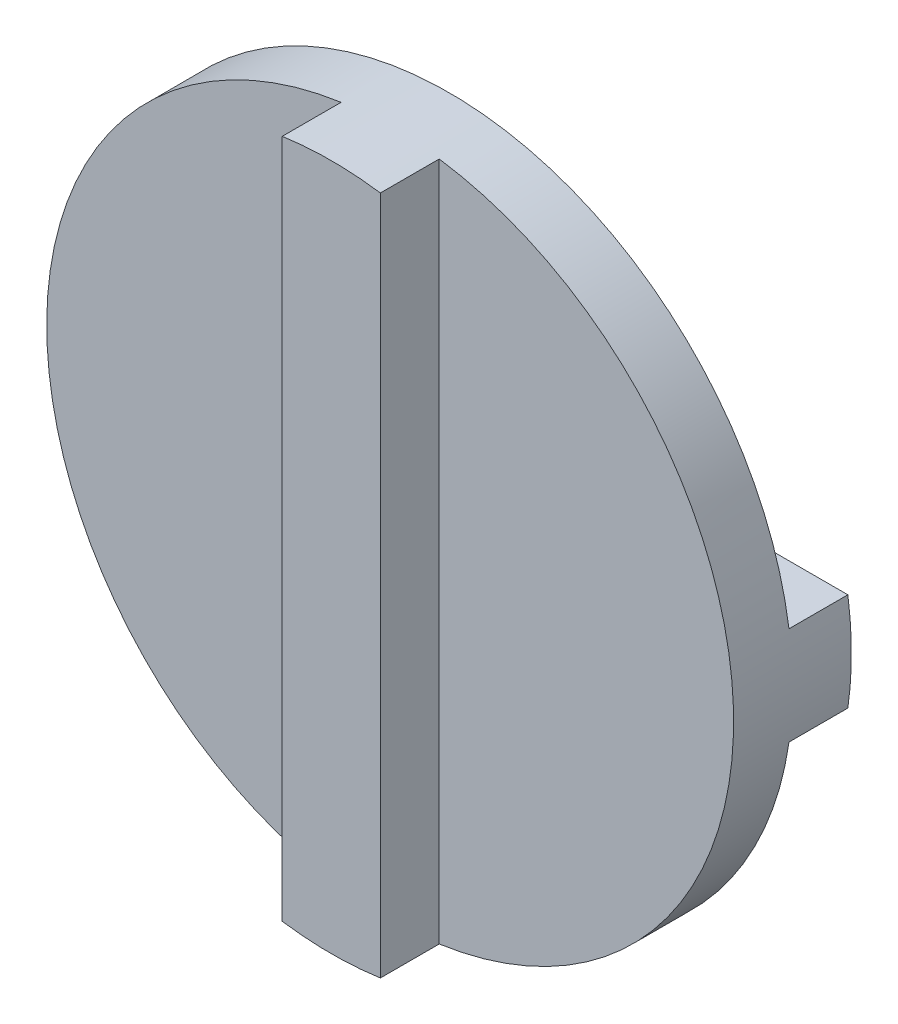
ISO-10303-21;
HEADER;
FILE_DESCRIPTION(('STEP AP214'),'2;1');
FILE_NAME('part.step','',(''),(''),'','','');
FILE_SCHEMA(('AUTOMOTIVE_DESIGN { 1 0 10303 214 1 1 1 1 }'));
ENDSEC;
DATA;
#1=APPLICATION_CONTEXT('core data for automotive mechanical design processes');
#2=APPLICATION_PROTOCOL_DEFINITION('international standard','automotive_design',2000,#1);
#3=PRODUCT_CONTEXT('',#1,'mechanical');
#4=PRODUCT('Part','Part','',(#3));
#5=PRODUCT_RELATED_PRODUCT_CATEGORY('part','',(#4));
#6=PRODUCT_DEFINITION_FORMATION('','',#4);
#7=PRODUCT_DEFINITION_CONTEXT('part definition',#1,'design');
#8=PRODUCT_DEFINITION('design','',#6,#7);
#9=PRODUCT_DEFINITION_SHAPE('','',#8);
#10=(LENGTH_UNIT() NAMED_UNIT(*) SI_UNIT(.MILLI.,.METRE.));
#11=(NAMED_UNIT(*) PLANE_ANGLE_UNIT() SI_UNIT($,.RADIAN.));
#12=(NAMED_UNIT(*) SI_UNIT($,.STERADIAN.) SOLID_ANGLE_UNIT());
#13=UNCERTAINTY_MEASURE_WITH_UNIT(LENGTH_MEASURE(1.E-05),#10,'distance_accuracy_value','');
#14=(GEOMETRIC_REPRESENTATION_CONTEXT(3) GLOBAL_UNCERTAINTY_ASSIGNED_CONTEXT((#13)) GLOBAL_UNIT_ASSIGNED_CONTEXT((#10,
#11,#12)) REPRESENTATION_CONTEXT('',''));
#15=CARTESIAN_POINT('',(0.,0.,0.));
#16=DIRECTION('',(0.,0.,1.));
#17=DIRECTION('',(1.,0.,0.));
#18=AXIS2_PLACEMENT_3D('',#15,#16,#17);
#19=CARTESIAN_POINT('',(0.,0.,0.));
#20=DIRECTION('',(0.,0.,1.));
#21=DIRECTION('',(1.,0.,0.));
#22=AXIS2_PLACEMENT_3D('',#19,#20,#21);
#23=PLANE('',#22);
#24=DIRECTION('',(-1.,0.,0.));
#25=VECTOR('',#24,1.);
#26=CARTESIAN_POINT('',(173.205080756888,-25.,0.));
#27=LINE('',#26,#25);
#28=CARTESIAN_POINT('',(173.205080756888,-25.,0.));
#29=VERTEX_POINT('',#28);
#30=CARTESIAN_POINT('',(-173.205080756888,-25.0000000000001,0.));
#31=VERTEX_POINT('',#30);
#32=EDGE_CURVE('E56',#29,#31,#27,.T.);
#33=ORIENTED_EDGE('',*,*,#32,.F.);
#34=CARTESIAN_POINT('',(0.,0.,0.));
#35=DIRECTION('',(0.,0.,1.));
#36=DIRECTION('',(1.,0.,0.));
#37=AXIS2_PLACEMENT_3D('',#34,#35,#36);
#38=CIRCLE('',#37,175.);
#39=EDGE_CURVE('E132',#31,#29,#38,.T.);
#40=ORIENTED_EDGE('',*,*,#39,.F.);
#41=EDGE_LOOP('',(#33,#40));
#42=FACE_BOUND('',#41,.T.);
#43=ADVANCED_FACE('F43',(#42),#23,.F.);
#44=CARTESIAN_POINT('',(0.,0.,30.));
#45=DIRECTION('',(0.,0.,1.));
#46=DIRECTION('',(1.,0.,0.));
#47=AXIS2_PLACEMENT_3D('',#44,#45,#46);
#48=PLANE('',#47);
#49=CARTESIAN_POINT('',(0.,0.,30.));
#50=DIRECTION('',(0.,0.,1.));
#51=DIRECTION('',(1.,0.,0.));
#52=AXIS2_PLACEMENT_3D('',#49,#50,#51);
#53=CIRCLE('',#52,175.);
#54=CARTESIAN_POINT('',(24.9999999999999,-173.205080756888,30.));
#55=VERTEX_POINT('',#54);
#56=CARTESIAN_POINT('',(24.9999999999999,173.205080756888,30.));
#57=VERTEX_POINT('',#56);
#58=EDGE_CURVE('E52',#55,#57,#53,.T.);
#59=ORIENTED_EDGE('',*,*,#58,.T.);
#60=DIRECTION('',(0.,-1.,0.));
#61=VECTOR('',#60,1.);
#62=CARTESIAN_POINT('',(24.9999999999999,173.205080756888,30.));
#63=LINE('',#62,#61);
#64=EDGE_CURVE('E136',#57,#55,#63,.T.);
#65=ORIENTED_EDGE('',*,*,#64,.T.);
#66=EDGE_LOOP('',(#59,#65));
#67=FACE_BOUND('',#66,.T.);
#68=ADVANCED_FACE('F226',(#67),#48,.T.);
#69=CARTESIAN_POINT('',(0.,0.,30.));
#70=DIRECTION('',(0.,0.,-1.));
#71=DIRECTION('',(-1.,0.,0.));
#72=AXIS2_PLACEMENT_3D('',#69,#70,#71);
#73=CYLINDRICAL_SURFACE('',#72,175.);
#74=CARTESIAN_POINT('',(-24.9999999999999,173.205080756888,30.));
#75=VERTEX_POINT('',#74);
#76=CARTESIAN_POINT('',(-24.9999999999999,-173.205080756888,30.));
#77=VERTEX_POINT('',#76);
#78=EDGE_CURVE('E11',#75,#77,#53,.T.);
#79=ORIENTED_EDGE('',*,*,#78,.F.);
#80=DIRECTION('',(0.,0.,-1.));
#81=VECTOR('',#80,1.);
#82=CARTESIAN_POINT('',(-24.9999999999999,173.205080756888,60.0000000000001));
#83=LINE('',#82,#81);
#84=CARTESIAN_POINT('',(-24.9999999999999,173.205080756888,60.0000000000001));
#85=VERTEX_POINT('',#84);
#86=EDGE_CURVE('E174',#85,#75,#83,.T.);
#87=ORIENTED_EDGE('',*,*,#86,.F.);
#88=CARTESIAN_POINT('',(0.,0.,60.0000000000001));
#89=DIRECTION('',(0.,0.,1.));
#90=DIRECTION('',(1.,0.,0.));
#91=AXIS2_PLACEMENT_3D('',#88,#89,#90);
#92=CIRCLE('',#91,175.);
#93=CARTESIAN_POINT('',(24.9999999999999,173.205080756888,60.0000000000001));
#94=VERTEX_POINT('',#93);
#95=EDGE_CURVE('E144',#94,#85,#92,.T.);
#96=ORIENTED_EDGE('',*,*,#95,.F.);
#97=DIRECTION('',(0.,0.,-1.));
#98=VECTOR('',#97,1.);
#99=CARTESIAN_POINT('',(24.9999999999999,173.205080756888,60.0000000000001));
#100=LINE('',#99,#98);
#101=EDGE_CURVE('E158',#94,#57,#100,.T.);
#102=ORIENTED_EDGE('',*,*,#101,.T.);
#103=ORIENTED_EDGE('',*,*,#58,.F.);
#104=DIRECTION('',(0.,0.,-1.));
#105=VECTOR('',#104,1.);
#106=CARTESIAN_POINT('',(24.9999999999999,-173.205080756888,60.0000000000001));
#107=LINE('',#106,#105);
#108=CARTESIAN_POINT('',(24.9999999999999,-173.205080756888,60.0000000000001));
#109=VERTEX_POINT('',#108);
#110=EDGE_CURVE('E164',#109,#55,#107,.T.);
#111=ORIENTED_EDGE('',*,*,#110,.F.);
#112=CARTESIAN_POINT('',(0.,0.,60.0000000000001));
#113=DIRECTION('',(0.,0.,1.));
#114=DIRECTION('',(1.,0.,0.));
#115=AXIS2_PLACEMENT_3D('',#112,#113,#114);
#116=CIRCLE('',#115,175.);
#117=CARTESIAN_POINT('',(-24.9999999999999,-173.205080756888,60.0000000000001));
#118=VERTEX_POINT('',#117);
#119=EDGE_CURVE('E155',#118,#109,#116,.T.);
#120=ORIENTED_EDGE('',*,*,#119,.F.);
#121=DIRECTION('',(0.,0.,-1.));
#122=VECTOR('',#121,1.);
#123=CARTESIAN_POINT('',(-24.9999999999999,-173.205080756888,60.0000000000001));
#124=LINE('',#123,#122);
#125=EDGE_CURVE('E166',#118,#77,#124,.T.);
#126=ORIENTED_EDGE('',*,*,#125,.T.);
#127=EDGE_LOOP('',(#79,#87,#96,#102,#103,#111,#120,#126));
#128=FACE_BOUND('',#127,.T.);
#129=CARTESIAN_POINT('',(173.205080756888,25.,0.));
#130=VERTEX_POINT('',#129);
#131=CARTESIAN_POINT('',(-173.205080756888,25.,0.));
#132=VERTEX_POINT('',#131);
#133=EDGE_CURVE('E50',#130,#132,#38,.T.);
#134=ORIENTED_EDGE('',*,*,#133,.T.);
#135=DIRECTION('',(0.,0.,1.));
#136=VECTOR('',#135,1.);
#137=CARTESIAN_POINT('',(-173.205080756888,25.,-30.));
#138=LINE('',#137,#136);
#139=CARTESIAN_POINT('',(-173.205080756888,25.,-30.));
#140=VERTEX_POINT('',#139);
#141=EDGE_CURVE('E143',#140,#132,#138,.T.);
#142=ORIENTED_EDGE('',*,*,#141,.F.);
#143=CARTESIAN_POINT('',(0.,0.,-30.));
#144=DIRECTION('',(0.,0.,-1.));
#145=DIRECTION('',(-1.,0.,0.));
#146=AXIS2_PLACEMENT_3D('',#143,#144,#145);
#147=CIRCLE('',#146,175.);
#148=CARTESIAN_POINT('',(-173.205080756888,-25.0000000000001,-30.));
#149=VERTEX_POINT('',#148);
#150=EDGE_CURVE('E116',#149,#140,#147,.T.);
#151=ORIENTED_EDGE('',*,*,#150,.F.);
#152=DIRECTION('',(0.,0.,1.));
#153=VECTOR('',#152,1.);
#154=CARTESIAN_POINT('',(-173.205080756888,-25.0000000000001,-30.));
#155=LINE('',#154,#153);
#156=EDGE_CURVE('E113',#149,#31,#155,.T.);
#157=ORIENTED_EDGE('',*,*,#156,.T.);
#158=ORIENTED_EDGE('',*,*,#39,.T.);
#159=DIRECTION('',(0.,0.,1.));
#160=VECTOR('',#159,1.);
#161=CARTESIAN_POINT('',(173.205080756888,-25.,-30.));
#162=LINE('',#161,#160);
#163=CARTESIAN_POINT('',(173.205080756888,-25.,-30.));
#164=VERTEX_POINT('',#163);
#165=EDGE_CURVE('E114',#164,#29,#162,.T.);
#166=ORIENTED_EDGE('',*,*,#165,.F.);
#167=CARTESIAN_POINT('',(0.,0.,-30.));
#168=DIRECTION('',(0.,0.,-1.));
#169=DIRECTION('',(-1.,0.,0.));
#170=AXIS2_PLACEMENT_3D('',#167,#168,#169);
#171=CIRCLE('',#170,175.);
#172=CARTESIAN_POINT('',(173.205080756888,25.,-30.));
#173=VERTEX_POINT('',#172);
#174=EDGE_CURVE('E118',#173,#164,#171,.T.);
#175=ORIENTED_EDGE('',*,*,#174,.F.);
#176=DIRECTION('',(0.,0.,1.));
#177=VECTOR('',#176,1.);
#178=CARTESIAN_POINT('',(173.205080756888,25.,-30.));
#179=LINE('',#178,#177);
#180=EDGE_CURVE('E198',#173,#130,#179,.T.);
#181=ORIENTED_EDGE('',*,*,#180,.T.);
#182=EDGE_LOOP('',(#134,#142,#151,#157,#158,#166,#175,#181));
#183=FACE_BOUND('',#182,.T.);
#184=ADVANCED_FACE('F44',(#128,#183),#73,.T.);
#185=DIRECTION('',(0.,-1.,0.));
#186=VECTOR('',#185,1.);
#187=CARTESIAN_POINT('',(-24.9999999999999,173.205080756888,30.));
#188=LINE('',#187,#186);
#189=EDGE_CURVE('E134',#75,#77,#188,.T.);
#190=ORIENTED_EDGE('',*,*,#189,.F.);
#191=ORIENTED_EDGE('',*,*,#78,.T.);
#192=EDGE_LOOP('',(#190,#191));
#193=FACE_BOUND('',#192,.T.);
#194=ADVANCED_FACE('F233',(#193),#48,.T.);
#195=ORIENTED_EDGE('',*,*,#133,.F.);
#196=DIRECTION('',(-1.,0.,0.));
#197=VECTOR('',#196,1.);
#198=CARTESIAN_POINT('',(173.205080756888,25.,0.));
#199=LINE('',#198,#197);
#200=EDGE_CURVE('E67',#130,#132,#199,.T.);
#201=ORIENTED_EDGE('',*,*,#200,.T.);
#202=EDGE_LOOP('',(#195,#201));
#203=FACE_BOUND('',#202,.T.);
#204=ADVANCED_FACE('F228',(#203),#23,.F.);
#205=CARTESIAN_POINT('',(-24.9999999999999,173.205080756888,60.0000000000001));
#206=DIRECTION('',(1.,0.,0.));
#207=DIRECTION('',(0.,1.,0.));
#208=AXIS2_PLACEMENT_3D('',#205,#206,#207);
#209=PLANE('',#208);
#210=ORIENTED_EDGE('',*,*,#189,.T.);
#211=ORIENTED_EDGE('',*,*,#125,.F.);
#212=DIRECTION('',(0.,-1.,0.));
#213=VECTOR('',#212,1.);
#214=CARTESIAN_POINT('',(-24.9999999999999,173.205080756888,60.0000000000001));
#215=LINE('',#214,#213);
#216=EDGE_CURVE('E149',#85,#118,#215,.T.);
#217=ORIENTED_EDGE('',*,*,#216,.F.);
#218=ORIENTED_EDGE('',*,*,#86,.T.);
#219=EDGE_LOOP('',(#210,#211,#217,#218));
#220=FACE_BOUND('',#219,.T.);
#221=ADVANCED_FACE('F240',(#220),#209,.F.);
#222=CARTESIAN_POINT('',(24.9999999999999,173.205080756888,60.0000000000001));
#223=DIRECTION('',(1.,0.,0.));
#224=DIRECTION('',(0.,1.,0.));
#225=AXIS2_PLACEMENT_3D('',#222,#223,#224);
#226=PLANE('',#225);
#227=ORIENTED_EDGE('',*,*,#64,.F.);
#228=ORIENTED_EDGE('',*,*,#101,.F.);
#229=DIRECTION('',(0.,-1.,0.));
#230=VECTOR('',#229,1.);
#231=CARTESIAN_POINT('',(24.9999999999999,173.205080756888,60.0000000000001));
#232=LINE('',#231,#230);
#233=EDGE_CURVE('E154',#94,#109,#232,.T.);
#234=ORIENTED_EDGE('',*,*,#233,.T.);
#235=ORIENTED_EDGE('',*,*,#110,.T.);
#236=EDGE_LOOP('',(#227,#228,#234,#235));
#237=FACE_BOUND('',#236,.T.);
#238=ADVANCED_FACE('F245',(#237),#226,.T.);
#239=CARTESIAN_POINT('',(0.,0.,60.0000000000001));
#240=DIRECTION('',(0.,0.,1.));
#241=DIRECTION('',(1.,0.,0.));
#242=AXIS2_PLACEMENT_3D('',#239,#240,#241);
#243=PLANE('',#242);
#244=ORIENTED_EDGE('',*,*,#95,.T.);
#245=ORIENTED_EDGE('',*,*,#216,.T.);
#246=ORIENTED_EDGE('',*,*,#119,.T.);
#247=ORIENTED_EDGE('',*,*,#233,.F.);
#248=EDGE_LOOP('',(#244,#245,#246,#247));
#249=FACE_BOUND('',#248,.T.);
#250=ADVANCED_FACE('F227',(#249),#243,.T.);
#251=CARTESIAN_POINT('',(173.205080756888,-25.,-30.));
#252=DIRECTION('',(0.,1.,0.));
#253=DIRECTION('',(-1.,0.,0.));
#254=AXIS2_PLACEMENT_3D('',#251,#252,#253);
#255=PLANE('',#254);
#256=ORIENTED_EDGE('',*,*,#32,.T.);
#257=ORIENTED_EDGE('',*,*,#156,.F.);
#258=DIRECTION('',(-1.,0.,0.));
#259=VECTOR('',#258,1.);
#260=CARTESIAN_POINT('',(173.205080756888,-25.,-30.));
#261=LINE('',#260,#259);
#262=EDGE_CURVE('E108',#164,#149,#261,.T.);
#263=ORIENTED_EDGE('',*,*,#262,.F.);
#264=ORIENTED_EDGE('',*,*,#165,.T.);
#265=EDGE_LOOP('',(#256,#257,#263,#264));
#266=FACE_BOUND('',#265,.T.);
#267=ADVANCED_FACE('F112',(#266),#255,.F.);
#268=CARTESIAN_POINT('',(173.205080756888,25.,-30.));
#269=DIRECTION('',(0.,1.,0.));
#270=DIRECTION('',(-1.,0.,0.));
#271=AXIS2_PLACEMENT_3D('',#268,#269,#270);
#272=PLANE('',#271);
#273=ORIENTED_EDGE('',*,*,#200,.F.);
#274=ORIENTED_EDGE('',*,*,#180,.F.);
#275=DIRECTION('',(-1.,0.,0.));
#276=VECTOR('',#275,1.);
#277=CARTESIAN_POINT('',(173.205080756888,25.,-30.));
#278=LINE('',#277,#276);
#279=EDGE_CURVE('E127',#173,#140,#278,.T.);
#280=ORIENTED_EDGE('',*,*,#279,.T.);
#281=ORIENTED_EDGE('',*,*,#141,.T.);
#282=EDGE_LOOP('',(#273,#274,#280,#281));
#283=FACE_BOUND('',#282,.T.);
#284=ADVANCED_FACE('F196',(#283),#272,.T.);
#285=CARTESIAN_POINT('',(0.,0.,-30.));
#286=DIRECTION('',(0.,0.,-1.));
#287=DIRECTION('',(-1.,0.,0.));
#288=AXIS2_PLACEMENT_3D('',#285,#286,#287);
#289=PLANE('',#288);
#290=ORIENTED_EDGE('',*,*,#174,.T.);
#291=ORIENTED_EDGE('',*,*,#262,.T.);
#292=ORIENTED_EDGE('',*,*,#150,.T.);
#293=ORIENTED_EDGE('',*,*,#279,.F.);
#294=EDGE_LOOP('',(#290,#291,#292,#293));
#295=FACE_BOUND('',#294,.T.);
#296=ADVANCED_FACE('F121',(#295),#289,.T.);
#297=CLOSED_SHELL('',(#43,#68,#184,#194,#204,#221,#238,#250,#267,#284,#296));
#298=MANIFOLD_SOLID_BREP('B2',#297);
#299=ADVANCED_BREP_SHAPE_REPRESENTATION('',(#18,#298),#14);
#300=SHAPE_DEFINITION_REPRESENTATION(#9,#299);
ENDSEC;
END-ISO-10303-21;
